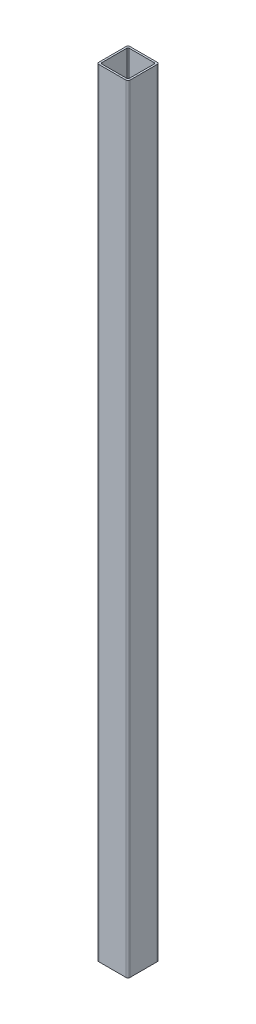
ISO-10303-21;
HEADER;
FILE_DESCRIPTION(('STEP AP214'),'2;1');
FILE_NAME('part.step','',(''),(''),'','','');
FILE_SCHEMA(('AUTOMOTIVE_DESIGN { 1 0 10303 214 1 1 1 1 }'));
ENDSEC;
DATA;
#1=APPLICATION_CONTEXT('core data for automotive mechanical design processes');
#2=APPLICATION_PROTOCOL_DEFINITION('international standard','automotive_design',2000,#1);
#3=PRODUCT_CONTEXT('',#1,'mechanical');
#4=PRODUCT('Part','Part','',(#3));
#5=PRODUCT_RELATED_PRODUCT_CATEGORY('part','',(#4));
#6=PRODUCT_DEFINITION_FORMATION('','',#4);
#7=PRODUCT_DEFINITION_CONTEXT('part definition',#1,'design');
#8=PRODUCT_DEFINITION('design','',#6,#7);
#9=PRODUCT_DEFINITION_SHAPE('','',#8);
#10=(LENGTH_UNIT() NAMED_UNIT(*) SI_UNIT(.MILLI.,.METRE.));
#11=(NAMED_UNIT(*) PLANE_ANGLE_UNIT() SI_UNIT($,.RADIAN.));
#12=(NAMED_UNIT(*) SI_UNIT($,.STERADIAN.) SOLID_ANGLE_UNIT());
#13=UNCERTAINTY_MEASURE_WITH_UNIT(LENGTH_MEASURE(1.E-05),#10,'distance_accuracy_value','');
#14=(GEOMETRIC_REPRESENTATION_CONTEXT(3) GLOBAL_UNCERTAINTY_ASSIGNED_CONTEXT((#13)) GLOBAL_UNIT_ASSIGNED_CONTEXT((#10,
#11,#12)) REPRESENTATION_CONTEXT('',''));
#15=CARTESIAN_POINT('',(0.,0.,0.));
#16=DIRECTION('',(0.,0.,1.));
#17=DIRECTION('',(1.,0.,0.));
#18=AXIS2_PLACEMENT_3D('',#15,#16,#17);
#19=CARTESIAN_POINT('',(1006.,5060.,94.));
#20=DIRECTION('',(0.,1.,0.));
#21=DIRECTION('',(0.,0.,1.));
#22=AXIS2_PLACEMENT_3D('',#19,#20,#21);
#23=PLANE('',#22);
#24=CARTESIAN_POINT('',(1006.,5060.,94.));
#25=DIRECTION('',(0.,1.,0.));
#26=DIRECTION('',(0.,0.,1.));
#27=AXIS2_PLACEMENT_3D('',#24,#25,#26);
#28=CIRCLE('',#27,6.00000000000014);
#29=CARTESIAN_POINT('',(1000.,5060.,94.));
#30=VERTEX_POINT('',#29);
#31=CARTESIAN_POINT('',(1006.,5060.,100.));
#32=VERTEX_POINT('',#31);
#33=EDGE_CURVE('E213',#30,#32,#28,.T.);
#34=ORIENTED_EDGE('',*,*,#33,.T.);
#35=DIRECTION('',(1.,0.,0.));
#36=VECTOR('',#35,1.);
#37=CARTESIAN_POINT('',(1006.,5060.,100.));
#38=LINE('',#37,#36);
#39=CARTESIAN_POINT('',(1094.,5060.,100.));
#40=VERTEX_POINT('',#39);
#41=EDGE_CURVE('E216',#32,#40,#38,.T.);
#42=ORIENTED_EDGE('',*,*,#41,.T.);
#43=CARTESIAN_POINT('',(1094.,5060.,94.));
#44=DIRECTION('',(0.,1.,0.));
#45=DIRECTION('',(0.,0.,1.));
#46=AXIS2_PLACEMENT_3D('',#43,#44,#45);
#47=CIRCLE('',#46,6.00000000000014);
#48=CARTESIAN_POINT('',(1100.,5060.,94.));
#49=VERTEX_POINT('',#48);
#50=EDGE_CURVE('E219',#40,#49,#47,.T.);
#51=ORIENTED_EDGE('',*,*,#50,.T.);
#52=DIRECTION('',(0.,0.,-1.));
#53=VECTOR('',#52,1.);
#54=CARTESIAN_POINT('',(1100.,5060.,6.00000000000001));
#55=LINE('',#54,#53);
#56=CARTESIAN_POINT('',(1100.,5060.,6.00000000000001));
#57=VERTEX_POINT('',#56);
#58=EDGE_CURVE('E221',#49,#57,#55,.T.);
#59=ORIENTED_EDGE('',*,*,#58,.T.);
#60=CARTESIAN_POINT('',(1094.,5060.,6.00000000000001));
#61=DIRECTION('',(0.,1.,0.));
#62=DIRECTION('',(0.,0.,-1.));
#63=AXIS2_PLACEMENT_3D('',#60,#61,#62);
#64=CIRCLE('',#63,6.00000000000014);
#65=CARTESIAN_POINT('',(1094.,5060.,0.));
#66=VERTEX_POINT('',#65);
#67=EDGE_CURVE('E223',#57,#66,#64,.T.);
#68=ORIENTED_EDGE('',*,*,#67,.T.);
#69=DIRECTION('',(-1.,0.,0.));
#70=VECTOR('',#69,1.);
#71=CARTESIAN_POINT('',(1006.,5060.,0.));
#72=LINE('',#71,#70);
#73=CARTESIAN_POINT('',(1006.,5060.,-1.38777878078145E-13));
#74=VERTEX_POINT('',#73);
#75=EDGE_CURVE('E225',#66,#74,#72,.T.);
#76=ORIENTED_EDGE('',*,*,#75,.T.);
#77=CARTESIAN_POINT('',(1006.,5060.,6.00000000000001));
#78=DIRECTION('',(0.,1.,0.));
#79=DIRECTION('',(0.,0.,1.));
#80=AXIS2_PLACEMENT_3D('',#77,#78,#79);
#81=CIRCLE('',#80,6.00000000000014);
#82=CARTESIAN_POINT('',(1000.,5060.,6.00000000000001));
#83=VERTEX_POINT('',#82);
#84=EDGE_CURVE('E227',#74,#83,#81,.T.);
#85=ORIENTED_EDGE('',*,*,#84,.T.);
#86=DIRECTION('',(0.,0.,1.));
#87=VECTOR('',#86,1.);
#88=CARTESIAN_POINT('',(1000.,5060.,6.00000000000001));
#89=LINE('',#88,#87);
#90=EDGE_CURVE('E229',#83,#30,#89,.T.);
#91=ORIENTED_EDGE('',*,*,#90,.T.);
#92=EDGE_LOOP('',(#34,#42,#51,#59,#68,#76,#85,#91));
#93=FACE_BOUND('',#92,.T.);
#94=DIRECTION('',(1.,0.,0.));
#95=VECTOR('',#94,1.);
#96=CARTESIAN_POINT('',(1010.,5060.,94.));
#97=LINE('',#96,#95);
#98=CARTESIAN_POINT('',(1010.,5060.,94.));
#99=VERTEX_POINT('',#98);
#100=CARTESIAN_POINT('',(1090.,5060.,93.9999999999997));
#101=VERTEX_POINT('',#100);
#102=EDGE_CURVE('E156',#99,#101,#97,.T.);
#103=ORIENTED_EDGE('',*,*,#102,.F.);
#104=CARTESIAN_POINT('',(1010.,5060.,90.));
#105=DIRECTION('',(0.,1.,0.));
#106=DIRECTION('',(0.,0.,1.));
#107=AXIS2_PLACEMENT_3D('',#104,#105,#106);
#108=CIRCLE('',#107,3.99999999999978);
#109=CARTESIAN_POINT('',(1006.,5060.,90.));
#110=VERTEX_POINT('',#109);
#111=EDGE_CURVE('E148',#110,#99,#108,.T.);
#112=ORIENTED_EDGE('',*,*,#111,.F.);
#113=DIRECTION('',(0.,0.,1.));
#114=VECTOR('',#113,1.);
#115=CARTESIAN_POINT('',(1006.,5060.,10.));
#116=LINE('',#115,#114);
#117=CARTESIAN_POINT('',(1006.,5060.,10.));
#118=VERTEX_POINT('',#117);
#119=EDGE_CURVE('E181',#118,#110,#116,.T.);
#120=ORIENTED_EDGE('',*,*,#119,.F.);
#121=CARTESIAN_POINT('',(1010.,5060.,10.));
#122=DIRECTION('',(0.,1.,0.));
#123=DIRECTION('',(0.,0.,1.));
#124=AXIS2_PLACEMENT_3D('',#121,#122,#123);
#125=CIRCLE('',#124,3.99999999999978);
#126=CARTESIAN_POINT('',(1010.,5060.,6.00000000000023));
#127=VERTEX_POINT('',#126);
#128=EDGE_CURVE('E179',#127,#118,#125,.T.);
#129=ORIENTED_EDGE('',*,*,#128,.F.);
#130=DIRECTION('',(-1.,0.,0.));
#131=VECTOR('',#130,1.);
#132=CARTESIAN_POINT('',(1010.,5060.,6.00000000000001));
#133=LINE('',#132,#131);
#134=CARTESIAN_POINT('',(1090.,5060.,6.00000000000001));
#135=VERTEX_POINT('',#134);
#136=EDGE_CURVE('E177',#135,#127,#133,.T.);
#137=ORIENTED_EDGE('',*,*,#136,.F.);
#138=CARTESIAN_POINT('',(1090.,5060.,10.));
#139=DIRECTION('',(0.,1.,0.));
#140=DIRECTION('',(0.,0.,-1.));
#141=AXIS2_PLACEMENT_3D('',#138,#139,#140);
#142=CIRCLE('',#141,3.99999999999978);
#143=CARTESIAN_POINT('',(1094.,5060.,10.));
#144=VERTEX_POINT('',#143);
#145=EDGE_CURVE('E175',#144,#135,#142,.T.);
#146=ORIENTED_EDGE('',*,*,#145,.F.);
#147=DIRECTION('',(0.,0.,-1.));
#148=VECTOR('',#147,1.);
#149=CARTESIAN_POINT('',(1094.,5060.,10.));
#150=LINE('',#149,#148);
#151=CARTESIAN_POINT('',(1094.,5060.,90.));
#152=VERTEX_POINT('',#151);
#153=EDGE_CURVE('E171',#152,#144,#150,.T.);
#154=ORIENTED_EDGE('',*,*,#153,.F.);
#155=CARTESIAN_POINT('',(1090.,5060.,90.));
#156=DIRECTION('',(0.,1.,0.));
#157=DIRECTION('',(0.,0.,1.));
#158=AXIS2_PLACEMENT_3D('',#155,#156,#157);
#159=CIRCLE('',#158,3.99999999999978);
#160=EDGE_CURVE('E169',#101,#152,#159,.T.);
#161=ORIENTED_EDGE('',*,*,#160,.F.);
#162=EDGE_LOOP('',(#103,#112,#120,#129,#137,#146,#154,#161));
#163=FACE_BOUND('',#162,.T.);
#164=ADVANCED_FACE('F35',(#93,#163),#23,.T.);
#165=CARTESIAN_POINT('',(1006.,2560.,94.));
#166=DIRECTION('',(0.,1.,0.));
#167=DIRECTION('',(0.,0.,1.));
#168=AXIS2_PLACEMENT_3D('',#165,#166,#167);
#169=PLANE('',#168);
#170=CARTESIAN_POINT('',(1006.,2560.,94.));
#171=DIRECTION('',(0.,1.,0.));
#172=DIRECTION('',(0.,0.,1.));
#173=AXIS2_PLACEMENT_3D('',#170,#171,#172);
#174=CIRCLE('',#173,6.00000000000014);
#175=CARTESIAN_POINT('',(1000.,2560.,94.));
#176=VERTEX_POINT('',#175);
#177=CARTESIAN_POINT('',(1006.,2560.,100.));
#178=VERTEX_POINT('',#177);
#179=EDGE_CURVE('E164',#176,#178,#174,.T.);
#180=ORIENTED_EDGE('',*,*,#179,.F.);
#181=DIRECTION('',(0.,0.,1.));
#182=VECTOR('',#181,1.);
#183=CARTESIAN_POINT('',(1000.,2560.,6.00000000000001));
#184=LINE('',#183,#182);
#185=CARTESIAN_POINT('',(1000.,2560.,6.00000000000001));
#186=VERTEX_POINT('',#185);
#187=EDGE_CURVE('E217',#186,#176,#184,.T.);
#188=ORIENTED_EDGE('',*,*,#187,.F.);
#189=CARTESIAN_POINT('',(1006.,2560.,6.00000000000001));
#190=DIRECTION('',(0.,1.,0.));
#191=DIRECTION('',(0.,0.,1.));
#192=AXIS2_PLACEMENT_3D('',#189,#190,#191);
#193=CIRCLE('',#192,6.00000000000014);
#194=CARTESIAN_POINT('',(1006.,2560.,-1.38777878078145E-13));
#195=VERTEX_POINT('',#194);
#196=EDGE_CURVE('E244',#195,#186,#193,.T.);
#197=ORIENTED_EDGE('',*,*,#196,.F.);
#198=DIRECTION('',(-1.,0.,0.));
#199=VECTOR('',#198,1.);
#200=CARTESIAN_POINT('',(1006.,2560.,0.));
#201=LINE('',#200,#199);
#202=CARTESIAN_POINT('',(1094.,2560.,0.));
#203=VERTEX_POINT('',#202);
#204=EDGE_CURVE('E242',#203,#195,#201,.T.);
#205=ORIENTED_EDGE('',*,*,#204,.F.);
#206=CARTESIAN_POINT('',(1094.,2560.,6.00000000000001));
#207=DIRECTION('',(0.,1.,0.));
#208=DIRECTION('',(0.,0.,-1.));
#209=AXIS2_PLACEMENT_3D('',#206,#207,#208);
#210=CIRCLE('',#209,6.00000000000014);
#211=CARTESIAN_POINT('',(1100.,2560.,6.00000000000001));
#212=VERTEX_POINT('',#211);
#213=EDGE_CURVE('E240',#212,#203,#210,.T.);
#214=ORIENTED_EDGE('',*,*,#213,.F.);
#215=DIRECTION('',(0.,0.,-1.));
#216=VECTOR('',#215,1.);
#217=CARTESIAN_POINT('',(1100.,2560.,6.00000000000001));
#218=LINE('',#217,#216);
#219=CARTESIAN_POINT('',(1100.,2560.,94.));
#220=VERTEX_POINT('',#219);
#221=EDGE_CURVE('E238',#220,#212,#218,.T.);
#222=ORIENTED_EDGE('',*,*,#221,.F.);
#223=CARTESIAN_POINT('',(1094.,2560.,94.));
#224=DIRECTION('',(0.,1.,0.));
#225=DIRECTION('',(0.,0.,1.));
#226=AXIS2_PLACEMENT_3D('',#223,#224,#225);
#227=CIRCLE('',#226,6.00000000000014);
#228=CARTESIAN_POINT('',(1094.,2560.,100.));
#229=VERTEX_POINT('',#228);
#230=EDGE_CURVE('E236',#229,#220,#227,.T.);
#231=ORIENTED_EDGE('',*,*,#230,.F.);
#232=DIRECTION('',(1.,0.,0.));
#233=VECTOR('',#232,1.);
#234=CARTESIAN_POINT('',(1006.,2560.,100.));
#235=LINE('',#234,#233);
#236=EDGE_CURVE('E234',#178,#229,#235,.T.);
#237=ORIENTED_EDGE('',*,*,#236,.F.);
#238=EDGE_LOOP('',(#180,#188,#197,#205,#214,#222,#231,#237));
#239=FACE_BOUND('',#238,.T.);
#240=CARTESIAN_POINT('',(1010.,2560.,90.));
#241=DIRECTION('',(0.,1.,0.));
#242=DIRECTION('',(0.,0.,1.));
#243=AXIS2_PLACEMENT_3D('',#240,#241,#242);
#244=CIRCLE('',#243,3.99999999999978);
#245=CARTESIAN_POINT('',(1006.,2560.,90.));
#246=VERTEX_POINT('',#245);
#247=CARTESIAN_POINT('',(1010.,2560.,94.));
#248=VERTEX_POINT('',#247);
#249=EDGE_CURVE('E58',#246,#248,#244,.T.);
#250=ORIENTED_EDGE('',*,*,#249,.T.);
#251=DIRECTION('',(1.,0.,0.));
#252=VECTOR('',#251,1.);
#253=CARTESIAN_POINT('',(1010.,2560.,94.));
#254=LINE('',#253,#252);
#255=CARTESIAN_POINT('',(1090.,2560.,93.9999999999997));
#256=VERTEX_POINT('',#255);
#257=EDGE_CURVE('E163',#248,#256,#254,.T.);
#258=ORIENTED_EDGE('',*,*,#257,.T.);
#259=CARTESIAN_POINT('',(1090.,2560.,90.));
#260=DIRECTION('',(0.,1.,0.));
#261=DIRECTION('',(0.,0.,1.));
#262=AXIS2_PLACEMENT_3D('',#259,#260,#261);
#263=CIRCLE('',#262,3.99999999999978);
#264=CARTESIAN_POINT('',(1094.,2560.,90.));
#265=VERTEX_POINT('',#264);
#266=EDGE_CURVE('E185',#256,#265,#263,.T.);
#267=ORIENTED_EDGE('',*,*,#266,.T.);
#268=DIRECTION('',(0.,0.,-1.));
#269=VECTOR('',#268,1.);
#270=CARTESIAN_POINT('',(1094.,2560.,10.));
#271=LINE('',#270,#269);
#272=CARTESIAN_POINT('',(1094.,2560.,10.));
#273=VERTEX_POINT('',#272);
#274=EDGE_CURVE('E188',#265,#273,#271,.T.);
#275=ORIENTED_EDGE('',*,*,#274,.T.);
#276=CARTESIAN_POINT('',(1090.,2560.,10.));
#277=DIRECTION('',(0.,1.,0.));
#278=DIRECTION('',(0.,0.,-1.));
#279=AXIS2_PLACEMENT_3D('',#276,#277,#278);
#280=CIRCLE('',#279,3.99999999999978);
#281=CARTESIAN_POINT('',(1090.,2560.,6.00000000000001));
#282=VERTEX_POINT('',#281);
#283=EDGE_CURVE('E191',#273,#282,#280,.T.);
#284=ORIENTED_EDGE('',*,*,#283,.T.);
#285=DIRECTION('',(-1.,0.,0.));
#286=VECTOR('',#285,1.);
#287=CARTESIAN_POINT('',(1010.,2560.,6.00000000000001));
#288=LINE('',#287,#286);
#289=CARTESIAN_POINT('',(1010.,2560.,6.00000000000023));
#290=VERTEX_POINT('',#289);
#291=EDGE_CURVE('E194',#282,#290,#288,.T.);
#292=ORIENTED_EDGE('',*,*,#291,.T.);
#293=CARTESIAN_POINT('',(1010.,2560.,10.));
#294=DIRECTION('',(0.,1.,0.));
#295=DIRECTION('',(0.,0.,1.));
#296=AXIS2_PLACEMENT_3D('',#293,#294,#295);
#297=CIRCLE('',#296,3.99999999999978);
#298=CARTESIAN_POINT('',(1006.,2560.,10.));
#299=VERTEX_POINT('',#298);
#300=EDGE_CURVE('E197',#290,#299,#297,.T.);
#301=ORIENTED_EDGE('',*,*,#300,.T.);
#302=DIRECTION('',(0.,0.,1.));
#303=VECTOR('',#302,1.);
#304=CARTESIAN_POINT('',(1006.,2560.,10.));
#305=LINE('',#304,#303);
#306=EDGE_CURVE('E157',#299,#246,#305,.T.);
#307=ORIENTED_EDGE('',*,*,#306,.T.);
#308=EDGE_LOOP('',(#250,#258,#267,#275,#284,#292,#301,#307));
#309=FACE_BOUND('',#308,.T.);
#310=ADVANCED_FACE('F274',(#239,#309),#169,.F.);
#311=CARTESIAN_POINT('',(1006.,5060.,94.));
#312=DIRECTION('',(0.,-1.,0.));
#313=DIRECTION('',(0.,0.,-1.));
#314=AXIS2_PLACEMENT_3D('',#311,#312,#313);
#315=CYLINDRICAL_SURFACE('',#314,6.00000000000014);
#316=ORIENTED_EDGE('',*,*,#179,.T.);
#317=DIRECTION('',(0.,-1.,0.));
#318=VECTOR('',#317,1.);
#319=CARTESIAN_POINT('',(1006.,5060.,100.));
#320=LINE('',#319,#318);
#321=EDGE_CURVE('E11',#32,#178,#320,.T.);
#322=ORIENTED_EDGE('',*,*,#321,.F.);
#323=ORIENTED_EDGE('',*,*,#33,.F.);
#324=DIRECTION('',(0.,-1.,0.));
#325=VECTOR('',#324,1.);
#326=CARTESIAN_POINT('',(1000.,5060.,94.));
#327=LINE('',#326,#325);
#328=EDGE_CURVE('E231',#30,#176,#327,.T.);
#329=ORIENTED_EDGE('',*,*,#328,.T.);
#330=EDGE_LOOP('',(#316,#322,#323,#329));
#331=FACE_BOUND('',#330,.T.);
#332=ADVANCED_FACE('F37',(#331),#315,.T.);
#333=CARTESIAN_POINT('',(1006.,5060.,100.));
#334=DIRECTION('',(0.,0.,-1.));
#335=DIRECTION('',(-1.,0.,0.));
#336=AXIS2_PLACEMENT_3D('',#333,#334,#335);
#337=PLANE('',#336);
#338=ORIENTED_EDGE('',*,*,#236,.T.);
#339=DIRECTION('',(0.,-1.,0.));
#340=VECTOR('',#339,1.);
#341=CARTESIAN_POINT('',(1094.,5060.,100.));
#342=LINE('',#341,#340);
#343=EDGE_CURVE('E43',#40,#229,#342,.T.);
#344=ORIENTED_EDGE('',*,*,#343,.F.);
#345=ORIENTED_EDGE('',*,*,#41,.F.);
#346=ORIENTED_EDGE('',*,*,#321,.T.);
#347=EDGE_LOOP('',(#338,#344,#345,#346));
#348=FACE_BOUND('',#347,.T.);
#349=ADVANCED_FACE('F291',(#348),#337,.F.);
#350=CARTESIAN_POINT('',(1094.,5060.,94.));
#351=DIRECTION('',(0.,-1.,0.));
#352=DIRECTION('',(0.,0.,-1.));
#353=AXIS2_PLACEMENT_3D('',#350,#351,#352);
#354=CYLINDRICAL_SURFACE('',#353,6.00000000000014);
#355=ORIENTED_EDGE('',*,*,#230,.T.);
#356=DIRECTION('',(0.,-1.,0.));
#357=VECTOR('',#356,1.);
#358=CARTESIAN_POINT('',(1100.,5060.,94.));
#359=LINE('',#358,#357);
#360=EDGE_CURVE('E261',#49,#220,#359,.T.);
#361=ORIENTED_EDGE('',*,*,#360,.F.);
#362=ORIENTED_EDGE('',*,*,#50,.F.);
#363=ORIENTED_EDGE('',*,*,#343,.T.);
#364=EDGE_LOOP('',(#355,#361,#362,#363));
#365=FACE_BOUND('',#364,.T.);
#366=ADVANCED_FACE('F268',(#365),#354,.T.);
#367=CARTESIAN_POINT('',(1100.,5060.,6.00000000000001));
#368=DIRECTION('',(-1.,0.,0.));
#369=DIRECTION('',(0.,0.,1.));
#370=AXIS2_PLACEMENT_3D('',#367,#368,#369);
#371=PLANE('',#370);
#372=ORIENTED_EDGE('',*,*,#221,.T.);
#373=DIRECTION('',(0.,-1.,0.));
#374=VECTOR('',#373,1.);
#375=CARTESIAN_POINT('',(1100.,5060.,6.00000000000001));
#376=LINE('',#375,#374);
#377=EDGE_CURVE('E258',#57,#212,#376,.T.);
#378=ORIENTED_EDGE('',*,*,#377,.F.);
#379=ORIENTED_EDGE('',*,*,#58,.F.);
#380=ORIENTED_EDGE('',*,*,#360,.T.);
#381=EDGE_LOOP('',(#372,#378,#379,#380));
#382=FACE_BOUND('',#381,.T.);
#383=ADVANCED_FACE('F280',(#382),#371,.F.);
#384=CARTESIAN_POINT('',(1094.,5060.,6.00000000000001));
#385=DIRECTION('',(0.,-1.,0.));
#386=DIRECTION('',(0.,0.,-1.));
#387=AXIS2_PLACEMENT_3D('',#384,#385,#386);
#388=CYLINDRICAL_SURFACE('',#387,6.00000000000014);
#389=ORIENTED_EDGE('',*,*,#213,.T.);
#390=DIRECTION('',(0.,-1.,0.));
#391=VECTOR('',#390,1.);
#392=CARTESIAN_POINT('',(1094.,5060.,0.));
#393=LINE('',#392,#391);
#394=EDGE_CURVE('E255',#66,#203,#393,.T.);
#395=ORIENTED_EDGE('',*,*,#394,.F.);
#396=ORIENTED_EDGE('',*,*,#67,.F.);
#397=ORIENTED_EDGE('',*,*,#377,.T.);
#398=EDGE_LOOP('',(#389,#395,#396,#397));
#399=FACE_BOUND('',#398,.T.);
#400=ADVANCED_FACE('F284',(#399),#388,.T.);
#401=CARTESIAN_POINT('',(1006.,5060.,0.));
#402=DIRECTION('',(0.,0.,1.));
#403=DIRECTION('',(1.,0.,0.));
#404=AXIS2_PLACEMENT_3D('',#401,#402,#403);
#405=PLANE('',#404);
#406=ORIENTED_EDGE('',*,*,#204,.T.);
#407=DIRECTION('',(0.,-1.,0.));
#408=VECTOR('',#407,1.);
#409=CARTESIAN_POINT('',(1006.,5060.,-1.38777878078145E-13));
#410=LINE('',#409,#408);
#411=EDGE_CURVE('E252',#74,#195,#410,.T.);
#412=ORIENTED_EDGE('',*,*,#411,.F.);
#413=ORIENTED_EDGE('',*,*,#75,.F.);
#414=ORIENTED_EDGE('',*,*,#394,.T.);
#415=EDGE_LOOP('',(#406,#412,#413,#414));
#416=FACE_BOUND('',#415,.T.);
#417=ADVANCED_FACE('F304',(#416),#405,.F.);
#418=CARTESIAN_POINT('',(1006.,5060.,6.00000000000001));
#419=DIRECTION('',(0.,-1.,0.));
#420=DIRECTION('',(0.,0.,-1.));
#421=AXIS2_PLACEMENT_3D('',#418,#419,#420);
#422=CYLINDRICAL_SURFACE('',#421,6.00000000000014);
#423=ORIENTED_EDGE('',*,*,#196,.T.);
#424=DIRECTION('',(0.,-1.,0.));
#425=VECTOR('',#424,1.);
#426=CARTESIAN_POINT('',(1000.,5060.,6.00000000000001));
#427=LINE('',#426,#425);
#428=EDGE_CURVE('E249',#83,#186,#427,.T.);
#429=ORIENTED_EDGE('',*,*,#428,.F.);
#430=ORIENTED_EDGE('',*,*,#84,.F.);
#431=ORIENTED_EDGE('',*,*,#411,.T.);
#432=EDGE_LOOP('',(#423,#429,#430,#431));
#433=FACE_BOUND('',#432,.T.);
#434=ADVANCED_FACE('F302',(#433),#422,.T.);
#435=CARTESIAN_POINT('',(1000.,5060.,6.00000000000001));
#436=DIRECTION('',(1.,0.,0.));
#437=DIRECTION('',(0.,0.,-1.));
#438=AXIS2_PLACEMENT_3D('',#435,#436,#437);
#439=PLANE('',#438);
#440=ORIENTED_EDGE('',*,*,#187,.T.);
#441=ORIENTED_EDGE('',*,*,#328,.F.);
#442=ORIENTED_EDGE('',*,*,#90,.F.);
#443=ORIENTED_EDGE('',*,*,#428,.T.);
#444=EDGE_LOOP('',(#440,#441,#442,#443));
#445=FACE_BOUND('',#444,.T.);
#446=ADVANCED_FACE('F297',(#445),#439,.F.);
#447=CARTESIAN_POINT('',(1010.,5060.,90.));
#448=DIRECTION('',(0.,-1.,0.));
#449=DIRECTION('',(0.,0.,-1.));
#450=AXIS2_PLACEMENT_3D('',#447,#448,#449);
#451=CYLINDRICAL_SURFACE('',#450,3.99999999999978);
#452=ORIENTED_EDGE('',*,*,#249,.F.);
#453=DIRECTION('',(0.,-1.,0.));
#454=VECTOR('',#453,1.);
#455=CARTESIAN_POINT('',(1006.,5060.,90.));
#456=LINE('',#455,#454);
#457=EDGE_CURVE('E152',#110,#246,#456,.T.);
#458=ORIENTED_EDGE('',*,*,#457,.F.);
#459=ORIENTED_EDGE('',*,*,#111,.T.);
#460=DIRECTION('',(0.,-1.,0.));
#461=VECTOR('',#460,1.);
#462=CARTESIAN_POINT('',(1010.,5060.,94.));
#463=LINE('',#462,#461);
#464=EDGE_CURVE('E151',#99,#248,#463,.T.);
#465=ORIENTED_EDGE('',*,*,#464,.T.);
#466=EDGE_LOOP('',(#452,#458,#459,#465));
#467=FACE_BOUND('',#466,.T.);
#468=ADVANCED_FACE('F150',(#467),#451,.F.);
#469=CARTESIAN_POINT('',(1010.,5060.,94.));
#470=DIRECTION('',(0.,0.,-1.));
#471=DIRECTION('',(-1.,0.,0.));
#472=AXIS2_PLACEMENT_3D('',#469,#470,#471);
#473=PLANE('',#472);
#474=ORIENTED_EDGE('',*,*,#257,.F.);
#475=ORIENTED_EDGE('',*,*,#464,.F.);
#476=ORIENTED_EDGE('',*,*,#102,.T.);
#477=DIRECTION('',(0.,-1.,0.));
#478=VECTOR('',#477,1.);
#479=CARTESIAN_POINT('',(1090.,5060.,93.9999999999997));
#480=LINE('',#479,#478);
#481=EDGE_CURVE('E165',#101,#256,#480,.T.);
#482=ORIENTED_EDGE('',*,*,#481,.T.);
#483=EDGE_LOOP('',(#474,#475,#476,#482));
#484=FACE_BOUND('',#483,.T.);
#485=ADVANCED_FACE('F160',(#484),#473,.T.);
#486=CARTESIAN_POINT('',(1090.,5060.,90.));
#487=DIRECTION('',(0.,-1.,0.));
#488=DIRECTION('',(0.,0.,-1.));
#489=AXIS2_PLACEMENT_3D('',#486,#487,#488);
#490=CYLINDRICAL_SURFACE('',#489,3.99999999999978);
#491=ORIENTED_EDGE('',*,*,#266,.F.);
#492=ORIENTED_EDGE('',*,*,#481,.F.);
#493=ORIENTED_EDGE('',*,*,#160,.T.);
#494=DIRECTION('',(0.,-1.,0.));
#495=VECTOR('',#494,1.);
#496=CARTESIAN_POINT('',(1094.,5060.,90.));
#497=LINE('',#496,#495);
#498=EDGE_CURVE('E210',#152,#265,#497,.T.);
#499=ORIENTED_EDGE('',*,*,#498,.T.);
#500=EDGE_LOOP('',(#491,#492,#493,#499));
#501=FACE_BOUND('',#500,.T.);
#502=ADVANCED_FACE('F329',(#501),#490,.F.);
#503=CARTESIAN_POINT('',(1094.,5060.,10.));
#504=DIRECTION('',(-1.,0.,0.));
#505=DIRECTION('',(0.,0.,1.));
#506=AXIS2_PLACEMENT_3D('',#503,#504,#505);
#507=PLANE('',#506);
#508=ORIENTED_EDGE('',*,*,#274,.F.);
#509=ORIENTED_EDGE('',*,*,#498,.F.);
#510=ORIENTED_EDGE('',*,*,#153,.T.);
#511=DIRECTION('',(0.,-1.,0.));
#512=VECTOR('',#511,1.);
#513=CARTESIAN_POINT('',(1094.,5060.,10.));
#514=LINE('',#513,#512);
#515=EDGE_CURVE('E208',#144,#273,#514,.T.);
#516=ORIENTED_EDGE('',*,*,#515,.T.);
#517=EDGE_LOOP('',(#508,#509,#510,#516));
#518=FACE_BOUND('',#517,.T.);
#519=ADVANCED_FACE('F333',(#518),#507,.T.);
#520=CARTESIAN_POINT('',(1090.,5060.,10.));
#521=DIRECTION('',(0.,-1.,0.));
#522=DIRECTION('',(0.,0.,-1.));
#523=AXIS2_PLACEMENT_3D('',#520,#521,#522);
#524=CYLINDRICAL_SURFACE('',#523,3.99999999999978);
#525=ORIENTED_EDGE('',*,*,#283,.F.);
#526=ORIENTED_EDGE('',*,*,#515,.F.);
#527=ORIENTED_EDGE('',*,*,#145,.T.);
#528=DIRECTION('',(0.,-1.,0.));
#529=VECTOR('',#528,1.);
#530=CARTESIAN_POINT('',(1090.,5060.,6.00000000000001));
#531=LINE('',#530,#529);
#532=EDGE_CURVE('E206',#135,#282,#531,.T.);
#533=ORIENTED_EDGE('',*,*,#532,.T.);
#534=EDGE_LOOP('',(#525,#526,#527,#533));
#535=FACE_BOUND('',#534,.T.);
#536=ADVANCED_FACE('F339',(#535),#524,.F.);
#537=CARTESIAN_POINT('',(1010.,5060.,6.00000000000001));
#538=DIRECTION('',(0.,0.,1.));
#539=DIRECTION('',(1.,0.,0.));
#540=AXIS2_PLACEMENT_3D('',#537,#538,#539);
#541=PLANE('',#540);
#542=ORIENTED_EDGE('',*,*,#291,.F.);
#543=ORIENTED_EDGE('',*,*,#532,.F.);
#544=ORIENTED_EDGE('',*,*,#136,.T.);
#545=DIRECTION('',(0.,-1.,0.));
#546=VECTOR('',#545,1.);
#547=CARTESIAN_POINT('',(1010.,5060.,6.00000000000023));
#548=LINE('',#547,#546);
#549=EDGE_CURVE('E204',#127,#290,#548,.T.);
#550=ORIENTED_EDGE('',*,*,#549,.T.);
#551=EDGE_LOOP('',(#542,#543,#544,#550));
#552=FACE_BOUND('',#551,.T.);
#553=ADVANCED_FACE('F343',(#552),#541,.T.);
#554=CARTESIAN_POINT('',(1010.,5060.,10.));
#555=DIRECTION('',(0.,-1.,0.));
#556=DIRECTION('',(0.,0.,-1.));
#557=AXIS2_PLACEMENT_3D('',#554,#555,#556);
#558=CYLINDRICAL_SURFACE('',#557,3.99999999999978);
#559=ORIENTED_EDGE('',*,*,#300,.F.);
#560=ORIENTED_EDGE('',*,*,#549,.F.);
#561=ORIENTED_EDGE('',*,*,#128,.T.);
#562=DIRECTION('',(0.,-1.,0.));
#563=VECTOR('',#562,1.);
#564=CARTESIAN_POINT('',(1006.,5060.,10.));
#565=LINE('',#564,#563);
#566=EDGE_CURVE('E50',#118,#299,#565,.T.);
#567=ORIENTED_EDGE('',*,*,#566,.T.);
#568=EDGE_LOOP('',(#559,#560,#561,#567));
#569=FACE_BOUND('',#568,.T.);
#570=ADVANCED_FACE('F347',(#569),#558,.F.);
#571=CARTESIAN_POINT('',(1006.,5060.,10.));
#572=DIRECTION('',(1.,0.,0.));
#573=DIRECTION('',(0.,0.,-1.));
#574=AXIS2_PLACEMENT_3D('',#571,#572,#573);
#575=PLANE('',#574);
#576=ORIENTED_EDGE('',*,*,#306,.F.);
#577=ORIENTED_EDGE('',*,*,#566,.F.);
#578=ORIENTED_EDGE('',*,*,#119,.T.);
#579=ORIENTED_EDGE('',*,*,#457,.T.);
#580=EDGE_LOOP('',(#576,#577,#578,#579));
#581=FACE_BOUND('',#580,.T.);
#582=ADVANCED_FACE('F351',(#581),#575,.T.);
#583=CLOSED_SHELL('',(#164,#310,#332,#349,#366,#383,#400,#417,#434,#446,#468,#485,#502,#519,
#536,#553,#570,#582));
#584=MANIFOLD_SOLID_BREP('B2',#583);
#585=ADVANCED_BREP_SHAPE_REPRESENTATION('',(#18,#584),#14);
#586=SHAPE_DEFINITION_REPRESENTATION(#9,#585);
ENDSEC;
END-ISO-10303-21;
